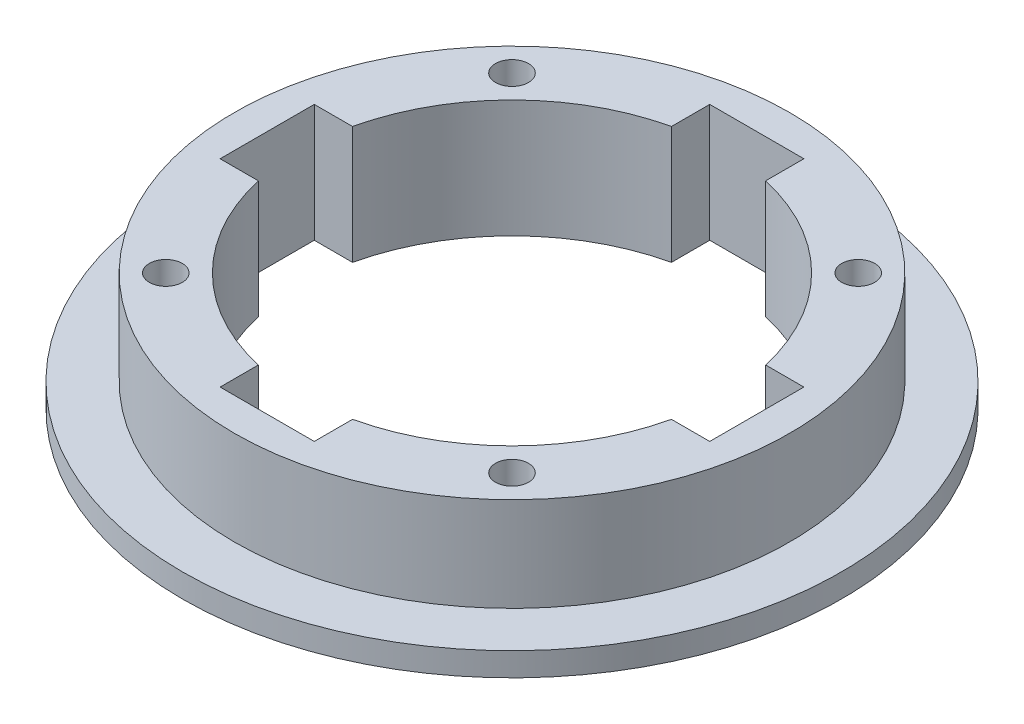
ISO-10303-21;
HEADER;
FILE_DESCRIPTION(('STEP AP214'),'2;1');
FILE_NAME('part.step','',(''),(''),'','','');
FILE_SCHEMA(('AUTOMOTIVE_DESIGN { 1 0 10303 214 1 1 1 1 }'));
ENDSEC;
DATA;
#1=APPLICATION_CONTEXT('core data for automotive mechanical design processes');
#2=APPLICATION_PROTOCOL_DEFINITION('international standard','automotive_design',2000,#1);
#3=PRODUCT_CONTEXT('',#1,'mechanical');
#4=PRODUCT('Part','Part','',(#3));
#5=PRODUCT_RELATED_PRODUCT_CATEGORY('part','',(#4));
#6=PRODUCT_DEFINITION_FORMATION('','',#4);
#7=PRODUCT_DEFINITION_CONTEXT('part definition',#1,'design');
#8=PRODUCT_DEFINITION('design','',#6,#7);
#9=PRODUCT_DEFINITION_SHAPE('','',#8);
#10=(LENGTH_UNIT() NAMED_UNIT(*) SI_UNIT(.MILLI.,.METRE.));
#11=(NAMED_UNIT(*) PLANE_ANGLE_UNIT() SI_UNIT($,.RADIAN.));
#12=(NAMED_UNIT(*) SI_UNIT($,.STERADIAN.) SOLID_ANGLE_UNIT());
#13=UNCERTAINTY_MEASURE_WITH_UNIT(LENGTH_MEASURE(1.E-05),#10,'distance_accuracy_value','');
#14=(GEOMETRIC_REPRESENTATION_CONTEXT(3) GLOBAL_UNCERTAINTY_ASSIGNED_CONTEXT((#13)) GLOBAL_UNIT_ASSIGNED_CONTEXT((#10,
#11,#12)) REPRESENTATION_CONTEXT('',''));
#15=CARTESIAN_POINT('',(0.,0.,0.));
#16=DIRECTION('',(0.,0.,1.));
#17=DIRECTION('',(1.,0.,0.));
#18=AXIS2_PLACEMENT_3D('',#15,#16,#17);
#19=CARTESIAN_POINT('',(0.,2.5,0.));
#20=DIRECTION('',(0.,-1.,0.));
#21=DIRECTION('',(0.,0.,-1.));
#22=AXIS2_PLACEMENT_3D('',#19,#20,#21);
#23=CYLINDRICAL_SURFACE('',#22,22.5);
#24=DIRECTION('',(0.,1.,0.));
#25=VECTOR('',#24,1.);
#26=CARTESIAN_POINT('',(-5.,0.,-21.9374109684803));
#27=LINE('',#26,#25);
#28=CARTESIAN_POINT('',(-5.,0.,-21.9374109684803));
#29=VERTEX_POINT('',#28);
#30=CARTESIAN_POINT('',(-5.,12.5,-21.9374109684803));
#31=VERTEX_POINT('',#30);
#32=EDGE_CURVE('E217',#29,#31,#27,.T.);
#33=ORIENTED_EDGE('',*,*,#32,.T.);
#34=CARTESIAN_POINT('',(0.,12.5,0.));
#35=DIRECTION('',(0.,1.,0.));
#36=DIRECTION('',(0.,0.,1.));
#37=AXIS2_PLACEMENT_3D('',#34,#35,#36);
#38=CIRCLE('',#37,22.5);
#39=CARTESIAN_POINT('',(-21.9374109684803,12.5,-5.));
#40=VERTEX_POINT('',#39);
#41=EDGE_CURVE('E162',#31,#40,#38,.T.);
#42=ORIENTED_EDGE('',*,*,#41,.T.);
#43=DIRECTION('',(0.,1.,0.));
#44=VECTOR('',#43,1.);
#45=CARTESIAN_POINT('',(-21.9374109684803,0.,-5.));
#46=LINE('',#45,#44);
#47=CARTESIAN_POINT('',(-21.9374109684803,0.,-5.));
#48=VERTEX_POINT('',#47);
#49=EDGE_CURVE('E56',#48,#40,#46,.T.);
#50=ORIENTED_EDGE('',*,*,#49,.F.);
#51=CARTESIAN_POINT('',(0.,0.,0.));
#52=DIRECTION('',(0.,1.,0.));
#53=DIRECTION('',(0.,0.,1.));
#54=AXIS2_PLACEMENT_3D('',#51,#52,#53);
#55=CIRCLE('',#54,22.5);
#56=EDGE_CURVE('E160',#29,#48,#55,.T.);
#57=ORIENTED_EDGE('',*,*,#56,.F.);
#58=EDGE_LOOP('',(#33,#42,#50,#57));
#59=FACE_BOUND('',#58,.T.);
#60=ADVANCED_FACE('F33',(#59),#23,.F.);
#61=DIRECTION('',(0.,1.,0.));
#62=VECTOR('',#61,1.);
#63=CARTESIAN_POINT('',(5.,0.,-21.9374109684803));
#64=LINE('',#63,#62);
#65=CARTESIAN_POINT('',(5.,0.,-21.9374109684803));
#66=VERTEX_POINT('',#65);
#67=CARTESIAN_POINT('',(5.,12.5,-21.9374109684803));
#68=VERTEX_POINT('',#67);
#69=EDGE_CURVE('E211',#66,#68,#64,.T.);
#70=ORIENTED_EDGE('',*,*,#69,.F.);
#71=CARTESIAN_POINT('',(21.9374109684803,0.,-5.));
#72=VERTEX_POINT('',#71);
#73=EDGE_CURVE('E169',#72,#66,#55,.T.);
#74=ORIENTED_EDGE('',*,*,#73,.F.);
#75=DIRECTION('',(0.,1.,0.));
#76=VECTOR('',#75,1.);
#77=CARTESIAN_POINT('',(21.9374109684803,0.,-5.));
#78=LINE('',#77,#76);
#79=CARTESIAN_POINT('',(21.9374109684803,12.5,-5.));
#80=VERTEX_POINT('',#79);
#81=EDGE_CURVE('E208',#72,#80,#78,.T.);
#82=ORIENTED_EDGE('',*,*,#81,.T.);
#83=EDGE_CURVE('E185',#80,#68,#38,.T.);
#84=ORIENTED_EDGE('',*,*,#83,.T.);
#85=EDGE_LOOP('',(#70,#74,#82,#84));
#86=FACE_BOUND('',#85,.T.);
#87=ADVANCED_FACE('F341',(#86),#23,.F.);
#88=DIRECTION('',(0.,1.,0.));
#89=VECTOR('',#88,1.);
#90=CARTESIAN_POINT('',(21.9374109684803,0.,4.99999999999999));
#91=LINE('',#90,#89);
#92=CARTESIAN_POINT('',(21.9374109684803,0.,4.99999999999999));
#93=VERTEX_POINT('',#92);
#94=CARTESIAN_POINT('',(21.9374109684803,12.5,5.));
#95=VERTEX_POINT('',#94);
#96=EDGE_CURVE('E202',#93,#95,#91,.T.);
#97=ORIENTED_EDGE('',*,*,#96,.F.);
#98=CARTESIAN_POINT('',(5.,0.,21.9374109684803));
#99=VERTEX_POINT('',#98);
#100=EDGE_CURVE('E173',#99,#93,#55,.T.);
#101=ORIENTED_EDGE('',*,*,#100,.F.);
#102=DIRECTION('',(0.,1.,0.));
#103=VECTOR('',#102,1.);
#104=CARTESIAN_POINT('',(5.,0.,21.9374109684803));
#105=LINE('',#104,#103);
#106=CARTESIAN_POINT('',(5.,12.5,21.9374109684803));
#107=VERTEX_POINT('',#106);
#108=EDGE_CURVE('E199',#99,#107,#105,.T.);
#109=ORIENTED_EDGE('',*,*,#108,.T.);
#110=EDGE_CURVE('E181',#107,#95,#38,.T.);
#111=ORIENTED_EDGE('',*,*,#110,.T.);
#112=EDGE_LOOP('',(#97,#101,#109,#111));
#113=FACE_BOUND('',#112,.T.);
#114=ADVANCED_FACE('F334',(#113),#23,.F.);
#115=CARTESIAN_POINT('',(0.,2.5,0.));
#116=DIRECTION('',(0.,1.,0.));
#117=DIRECTION('',(0.,0.,1.));
#118=AXIS2_PLACEMENT_3D('',#115,#116,#117);
#119=PLANE('',#118);
#120=CARTESIAN_POINT('',(0.,2.5,0.));
#121=DIRECTION('',(0.,1.,0.));
#122=DIRECTION('',(0.,0.,1.));
#123=AXIS2_PLACEMENT_3D('',#120,#121,#122);
#124=CIRCLE('',#123,35.);
#125=CARTESIAN_POINT('',(0.,2.5,35.));
#126=VERTEX_POINT('',#125);
#127=EDGE_CURVE('E11',#126,#126,#124,.T.);
#128=ORIENTED_EDGE('',*,*,#127,.T.);
#129=EDGE_LOOP('',(#128));
#130=FACE_BOUND('',#129,.T.);
#131=CARTESIAN_POINT('',(0.,2.5,0.));
#132=DIRECTION('',(0.,1.,0.));
#133=DIRECTION('',(0.,0.,1.));
#134=AXIS2_PLACEMENT_3D('',#131,#132,#133);
#135=CIRCLE('',#134,29.5);
#136=CARTESIAN_POINT('',(0.,2.5,29.5));
#137=VERTEX_POINT('',#136);
#138=EDGE_CURVE('E178',#137,#137,#135,.T.);
#139=ORIENTED_EDGE('',*,*,#138,.F.);
#140=EDGE_LOOP('',(#139));
#141=FACE_BOUND('',#140,.T.);
#142=ADVANCED_FACE('F332',(#130,#141),#119,.T.);
#143=CARTESIAN_POINT('',(0.,0.,0.));
#144=DIRECTION('',(0.,1.,0.));
#145=DIRECTION('',(0.,0.,1.));
#146=AXIS2_PLACEMENT_3D('',#143,#144,#145);
#147=PLANE('',#146);
#148=CARTESIAN_POINT('',(-18.3847763108502,0.,-18.3847763108503));
#149=DIRECTION('',(0.,1.,0.));
#150=DIRECTION('',(0.,0.,1.));
#151=AXIS2_PLACEMENT_3D('',#148,#149,#150);
#152=CIRCLE('',#151,1.75);
#153=CARTESIAN_POINT('',(-18.3847763108502,0.,-16.6347763108503));
#154=VERTEX_POINT('',#153);
#155=EDGE_CURVE('E280',#154,#154,#152,.T.);
#156=ORIENTED_EDGE('',*,*,#155,.T.);
#157=EDGE_LOOP('',(#156));
#158=FACE_BOUND('',#157,.T.);
#159=CARTESIAN_POINT('',(18.3847763108503,0.,-18.3847763108501));
#160=DIRECTION('',(0.,1.,0.));
#161=DIRECTION('',(0.,0.,1.));
#162=AXIS2_PLACEMENT_3D('',#159,#160,#161);
#163=CIRCLE('',#162,1.75);
#164=CARTESIAN_POINT('',(18.3847763108503,0.,-16.6347763108501));
#165=VERTEX_POINT('',#164);
#166=EDGE_CURVE('E292',#165,#165,#163,.T.);
#167=ORIENTED_EDGE('',*,*,#166,.T.);
#168=EDGE_LOOP('',(#167));
#169=FACE_BOUND('',#168,.T.);
#170=CARTESIAN_POINT('',(18.3847763108501,0.,18.3847763108504));
#171=DIRECTION('',(0.,1.,0.));
#172=DIRECTION('',(0.,0.,1.));
#173=AXIS2_PLACEMENT_3D('',#170,#171,#172);
#174=CIRCLE('',#173,1.75);
#175=CARTESIAN_POINT('',(18.3847763108501,0.,20.1347763108504));
#176=VERTEX_POINT('',#175);
#177=EDGE_CURVE('E286',#176,#176,#174,.T.);
#178=ORIENTED_EDGE('',*,*,#177,.T.);
#179=EDGE_LOOP('',(#178));
#180=FACE_BOUND('',#179,.T.);
#181=CARTESIAN_POINT('',(-18.3847763108502,0.,18.3847763108503));
#182=DIRECTION('',(0.,1.,0.));
#183=DIRECTION('',(0.,0.,1.));
#184=AXIS2_PLACEMENT_3D('',#181,#182,#183);
#185=CIRCLE('',#184,1.75);
#186=CARTESIAN_POINT('',(-18.3847763108502,0.,20.1347763108503));
#187=VERTEX_POINT('',#186);
#188=EDGE_CURVE('E248',#187,#187,#185,.T.);
#189=ORIENTED_EDGE('',*,*,#188,.T.);
#190=EDGE_LOOP('',(#189));
#191=FACE_BOUND('',#190,.T.);
#192=CARTESIAN_POINT('',(0.,0.,0.));
#193=DIRECTION('',(0.,1.,0.));
#194=DIRECTION('',(0.,0.,1.));
#195=AXIS2_PLACEMENT_3D('',#192,#193,#194);
#196=CIRCLE('',#195,35.);
#197=CARTESIAN_POINT('',(0.,0.,35.));
#198=VERTEX_POINT('',#197);
#199=EDGE_CURVE('E37',#198,#198,#196,.T.);
#200=ORIENTED_EDGE('',*,*,#199,.F.);
#201=EDGE_LOOP('',(#200));
#202=FACE_BOUND('',#201,.T.);
#203=DIRECTION('',(-1.,0.,0.));
#204=VECTOR('',#203,1.);
#205=CARTESIAN_POINT('',(5.,0.,-26.));
#206=LINE('',#205,#204);
#207=CARTESIAN_POINT('',(5.,0.,-26.));
#208=VERTEX_POINT('',#207);
#209=CARTESIAN_POINT('',(-5.,0.,-26.));
#210=VERTEX_POINT('',#209);
#211=EDGE_CURVE('E250',#208,#210,#206,.T.);
#212=ORIENTED_EDGE('',*,*,#211,.T.);
#213=DIRECTION('',(0.,0.,1.));
#214=VECTOR('',#213,1.);
#215=CARTESIAN_POINT('',(-5.,0.,-21.9374109684803));
#216=LINE('',#215,#214);
#217=EDGE_CURVE('E163',#210,#29,#216,.T.);
#218=ORIENTED_EDGE('',*,*,#217,.T.);
#219=ORIENTED_EDGE('',*,*,#56,.T.);
#220=DIRECTION('',(-1.,0.,0.));
#221=VECTOR('',#220,1.);
#222=CARTESIAN_POINT('',(-21.9374109684803,0.,-5.));
#223=LINE('',#222,#221);
#224=CARTESIAN_POINT('',(-26.,0.,-5.));
#225=VERTEX_POINT('',#224);
#226=EDGE_CURVE('E146',#48,#225,#223,.T.);
#227=ORIENTED_EDGE('',*,*,#226,.T.);
#228=DIRECTION('',(0.,0.,1.));
#229=VECTOR('',#228,1.);
#230=CARTESIAN_POINT('',(-26.,0.,5.));
#231=LINE('',#230,#229);
#232=CARTESIAN_POINT('',(-26.,0.,5.));
#233=VERTEX_POINT('',#232);
#234=EDGE_CURVE('E153',#225,#233,#231,.T.);
#235=ORIENTED_EDGE('',*,*,#234,.T.);
#236=DIRECTION('',(1.,0.,0.));
#237=VECTOR('',#236,1.);
#238=CARTESIAN_POINT('',(-21.9374109684803,0.,5.));
#239=LINE('',#238,#237);
#240=CARTESIAN_POINT('',(-21.9374109684803,0.,5.));
#241=VERTEX_POINT('',#240);
#242=EDGE_CURVE('E273',#233,#241,#239,.T.);
#243=ORIENTED_EDGE('',*,*,#242,.T.);
#244=CARTESIAN_POINT('',(-5.,0.,21.9374109684803));
#245=VERTEX_POINT('',#244);
#246=EDGE_CURVE('E170',#241,#245,#55,.T.);
#247=ORIENTED_EDGE('',*,*,#246,.T.);
#248=DIRECTION('',(0.,0.,1.));
#249=VECTOR('',#248,1.);
#250=CARTESIAN_POINT('',(-5.,0.,26.));
#251=LINE('',#250,#249);
#252=CARTESIAN_POINT('',(-5.,0.,26.));
#253=VERTEX_POINT('',#252);
#254=EDGE_CURVE('E270',#245,#253,#251,.T.);
#255=ORIENTED_EDGE('',*,*,#254,.T.);
#256=DIRECTION('',(1.,0.,0.));
#257=VECTOR('',#256,1.);
#258=CARTESIAN_POINT('',(5.,0.,26.));
#259=LINE('',#258,#257);
#260=CARTESIAN_POINT('',(5.,0.,26.));
#261=VERTEX_POINT('',#260);
#262=EDGE_CURVE('E267',#253,#261,#259,.T.);
#263=ORIENTED_EDGE('',*,*,#262,.T.);
#264=DIRECTION('',(0.,0.,-1.));
#265=VECTOR('',#264,1.);
#266=CARTESIAN_POINT('',(5.,0.,26.));
#267=LINE('',#266,#265);
#268=EDGE_CURVE('E264',#261,#99,#267,.T.);
#269=ORIENTED_EDGE('',*,*,#268,.T.);
#270=ORIENTED_EDGE('',*,*,#100,.T.);
#271=DIRECTION('',(1.,0.,0.));
#272=VECTOR('',#271,1.);
#273=CARTESIAN_POINT('',(26.,0.,5.));
#274=LINE('',#273,#272);
#275=CARTESIAN_POINT('',(26.,0.,5.));
#276=VERTEX_POINT('',#275);
#277=EDGE_CURVE('E261',#93,#276,#274,.T.);
#278=ORIENTED_EDGE('',*,*,#277,.T.);
#279=DIRECTION('',(0.,0.,-1.));
#280=VECTOR('',#279,1.);
#281=CARTESIAN_POINT('',(26.,0.,5.));
#282=LINE('',#281,#280);
#283=CARTESIAN_POINT('',(26.,0.,-5.));
#284=VERTEX_POINT('',#283);
#285=EDGE_CURVE('E258',#276,#284,#282,.T.);
#286=ORIENTED_EDGE('',*,*,#285,.T.);
#287=DIRECTION('',(-1.,0.,0.));
#288=VECTOR('',#287,1.);
#289=CARTESIAN_POINT('',(26.,0.,-5.));
#290=LINE('',#289,#288);
#291=EDGE_CURVE('E255',#284,#72,#290,.T.);
#292=ORIENTED_EDGE('',*,*,#291,.T.);
#293=ORIENTED_EDGE('',*,*,#73,.T.);
#294=DIRECTION('',(0.,0.,-1.));
#295=VECTOR('',#294,1.);
#296=CARTESIAN_POINT('',(5.,0.,-21.9374109684803));
#297=LINE('',#296,#295);
#298=EDGE_CURVE('E252',#66,#208,#297,.T.);
#299=ORIENTED_EDGE('',*,*,#298,.T.);
#300=EDGE_LOOP('',(#212,#218,#219,#227,#235,#243,#247,#255,#263,#269,#270,#278,#286,#292,#293,#299));
#301=FACE_BOUND('',#300,.T.);
#302=ADVANCED_FACE('F167',(#158,#169,#180,#191,#202,#301),#147,.F.);
#303=CARTESIAN_POINT('',(0.,2.5,0.));
#304=DIRECTION('',(0.,-1.,0.));
#305=DIRECTION('',(0.,0.,-1.));
#306=AXIS2_PLACEMENT_3D('',#303,#304,#305);
#307=CYLINDRICAL_SURFACE('',#306,35.);
#308=ORIENTED_EDGE('',*,*,#127,.F.);
#309=EDGE_LOOP('',(#308));
#310=FACE_BOUND('',#309,.T.);
#311=ORIENTED_EDGE('',*,*,#199,.T.);
#312=EDGE_LOOP('',(#311));
#313=FACE_BOUND('',#312,.T.);
#314=ADVANCED_FACE('F35',(#310,#313),#307,.T.);
#315=DIRECTION('',(0.,1.,0.));
#316=VECTOR('',#315,1.);
#317=CARTESIAN_POINT('',(-5.,0.,21.9374109684803));
#318=LINE('',#317,#316);
#319=CARTESIAN_POINT('',(-5.,12.5,21.9374109684803));
#320=VERTEX_POINT('',#319);
#321=EDGE_CURVE('E48',#245,#320,#318,.T.);
#322=ORIENTED_EDGE('',*,*,#321,.F.);
#323=ORIENTED_EDGE('',*,*,#246,.F.);
#324=DIRECTION('',(0.,1.,0.));
#325=VECTOR('',#324,1.);
#326=CARTESIAN_POINT('',(-21.9374109684803,0.,5.));
#327=LINE('',#326,#325);
#328=CARTESIAN_POINT('',(-21.9374109684803,12.5,5.));
#329=VERTEX_POINT('',#328);
#330=EDGE_CURVE('E191',#241,#329,#327,.T.);
#331=ORIENTED_EDGE('',*,*,#330,.T.);
#332=EDGE_CURVE('E186',#329,#320,#38,.T.);
#333=ORIENTED_EDGE('',*,*,#332,.T.);
#334=EDGE_LOOP('',(#322,#323,#331,#333));
#335=FACE_BOUND('',#334,.T.);
#336=ADVANCED_FACE('F314',(#335),#23,.F.);
#337=CARTESIAN_POINT('',(0.,12.5,0.));
#338=DIRECTION('',(0.,1.,0.));
#339=DIRECTION('',(0.,0.,1.));
#340=AXIS2_PLACEMENT_3D('',#337,#338,#339);
#341=PLANE('',#340);
#342=CARTESIAN_POINT('',(-18.3847763108502,12.5,-18.3847763108503));
#343=DIRECTION('',(0.,1.,0.));
#344=DIRECTION('',(0.,0.,1.));
#345=AXIS2_PLACEMENT_3D('',#342,#343,#344);
#346=CIRCLE('',#345,1.75);
#347=CARTESIAN_POINT('',(-18.3847763108502,12.5,-16.6347763108503));
#348=VERTEX_POINT('',#347);
#349=EDGE_CURVE('E295',#348,#348,#346,.T.);
#350=ORIENTED_EDGE('',*,*,#349,.F.);
#351=EDGE_LOOP('',(#350));
#352=FACE_BOUND('',#351,.T.);
#353=CARTESIAN_POINT('',(18.3847763108503,12.5,-18.3847763108501));
#354=DIRECTION('',(0.,1.,0.));
#355=DIRECTION('',(0.,0.,1.));
#356=AXIS2_PLACEMENT_3D('',#353,#354,#355);
#357=CIRCLE('',#356,1.75);
#358=CARTESIAN_POINT('',(18.3847763108503,12.5,-16.6347763108501));
#359=VERTEX_POINT('',#358);
#360=EDGE_CURVE('E289',#359,#359,#357,.T.);
#361=ORIENTED_EDGE('',*,*,#360,.F.);
#362=EDGE_LOOP('',(#361));
#363=FACE_BOUND('',#362,.T.);
#364=CARTESIAN_POINT('',(18.3847763108501,12.5,18.3847763108504));
#365=DIRECTION('',(0.,1.,0.));
#366=DIRECTION('',(0.,0.,1.));
#367=AXIS2_PLACEMENT_3D('',#364,#365,#366);
#368=CIRCLE('',#367,1.75);
#369=CARTESIAN_POINT('',(18.3847763108501,12.5,20.1347763108504));
#370=VERTEX_POINT('',#369);
#371=EDGE_CURVE('E283',#370,#370,#368,.T.);
#372=ORIENTED_EDGE('',*,*,#371,.F.);
#373=EDGE_LOOP('',(#372));
#374=FACE_BOUND('',#373,.T.);
#375=CARTESIAN_POINT('',(-18.3847763108502,12.5,18.3847763108503));
#376=DIRECTION('',(0.,1.,0.));
#377=DIRECTION('',(0.,0.,1.));
#378=AXIS2_PLACEMENT_3D('',#375,#376,#377);
#379=CIRCLE('',#378,1.75);
#380=CARTESIAN_POINT('',(-18.3847763108502,12.5,20.1347763108503));
#381=VERTEX_POINT('',#380);
#382=EDGE_CURVE('E277',#381,#381,#379,.T.);
#383=ORIENTED_EDGE('',*,*,#382,.F.);
#384=EDGE_LOOP('',(#383));
#385=FACE_BOUND('',#384,.T.);
#386=DIRECTION('',(0.,0.,1.));
#387=VECTOR('',#386,1.);
#388=CARTESIAN_POINT('',(-5.,12.5,-21.9374109684803));
#389=LINE('',#388,#387);
#390=CARTESIAN_POINT('',(-5.,12.5,-26.));
#391=VERTEX_POINT('',#390);
#392=EDGE_CURVE('E154',#391,#31,#389,.T.);
#393=ORIENTED_EDGE('',*,*,#392,.F.);
#394=DIRECTION('',(-1.,0.,0.));
#395=VECTOR('',#394,1.);
#396=CARTESIAN_POINT('',(5.,12.5,-26.));
#397=LINE('',#396,#395);
#398=CARTESIAN_POINT('',(5.,12.5,-26.));
#399=VERTEX_POINT('',#398);
#400=EDGE_CURVE('E220',#399,#391,#397,.T.);
#401=ORIENTED_EDGE('',*,*,#400,.F.);
#402=DIRECTION('',(0.,0.,-1.));
#403=VECTOR('',#402,1.);
#404=CARTESIAN_POINT('',(5.,12.5,-21.9374109684803));
#405=LINE('',#404,#403);
#406=EDGE_CURVE('E223',#68,#399,#405,.T.);
#407=ORIENTED_EDGE('',*,*,#406,.F.);
#408=ORIENTED_EDGE('',*,*,#83,.F.);
#409=DIRECTION('',(-1.,0.,0.));
#410=VECTOR('',#409,1.);
#411=CARTESIAN_POINT('',(26.,12.5,-5.));
#412=LINE('',#411,#410);
#413=CARTESIAN_POINT('',(26.,12.5,-5.));
#414=VERTEX_POINT('',#413);
#415=EDGE_CURVE('E226',#414,#80,#412,.T.);
#416=ORIENTED_EDGE('',*,*,#415,.F.);
#417=DIRECTION('',(0.,0.,-1.));
#418=VECTOR('',#417,1.);
#419=CARTESIAN_POINT('',(26.,12.5,5.));
#420=LINE('',#419,#418);
#421=CARTESIAN_POINT('',(26.,12.5,5.));
#422=VERTEX_POINT('',#421);
#423=EDGE_CURVE('E228',#422,#414,#420,.T.);
#424=ORIENTED_EDGE('',*,*,#423,.F.);
#425=DIRECTION('',(1.,0.,0.));
#426=VECTOR('',#425,1.);
#427=CARTESIAN_POINT('',(26.,12.5,5.));
#428=LINE('',#427,#426);
#429=EDGE_CURVE('E231',#95,#422,#428,.T.);
#430=ORIENTED_EDGE('',*,*,#429,.F.);
#431=ORIENTED_EDGE('',*,*,#110,.F.);
#432=DIRECTION('',(0.,0.,-1.));
#433=VECTOR('',#432,1.);
#434=CARTESIAN_POINT('',(5.,12.5,26.));
#435=LINE('',#434,#433);
#436=CARTESIAN_POINT('',(5.,12.5,26.));
#437=VERTEX_POINT('',#436);
#438=EDGE_CURVE('E234',#437,#107,#435,.T.);
#439=ORIENTED_EDGE('',*,*,#438,.F.);
#440=DIRECTION('',(1.,0.,0.));
#441=VECTOR('',#440,1.);
#442=CARTESIAN_POINT('',(5.,12.5,26.));
#443=LINE('',#442,#441);
#444=CARTESIAN_POINT('',(-5.,12.5,26.));
#445=VERTEX_POINT('',#444);
#446=EDGE_CURVE('E236',#445,#437,#443,.T.);
#447=ORIENTED_EDGE('',*,*,#446,.F.);
#448=DIRECTION('',(0.,0.,1.));
#449=VECTOR('',#448,1.);
#450=CARTESIAN_POINT('',(-5.,12.5,26.));
#451=LINE('',#450,#449);
#452=EDGE_CURVE('E239',#320,#445,#451,.T.);
#453=ORIENTED_EDGE('',*,*,#452,.F.);
#454=ORIENTED_EDGE('',*,*,#332,.F.);
#455=DIRECTION('',(1.,0.,0.));
#456=VECTOR('',#455,1.);
#457=CARTESIAN_POINT('',(-21.9374109684803,12.5,5.));
#458=LINE('',#457,#456);
#459=CARTESIAN_POINT('',(-26.,12.5,5.));
#460=VERTEX_POINT('',#459);
#461=EDGE_CURVE('E241',#460,#329,#458,.T.);
#462=ORIENTED_EDGE('',*,*,#461,.F.);
#463=DIRECTION('',(0.,0.,1.));
#464=VECTOR('',#463,1.);
#465=CARTESIAN_POINT('',(-26.,12.5,5.));
#466=LINE('',#465,#464);
#467=CARTESIAN_POINT('',(-26.,12.5,-5.));
#468=VERTEX_POINT('',#467);
#469=EDGE_CURVE('E243',#468,#460,#466,.T.);
#470=ORIENTED_EDGE('',*,*,#469,.F.);
#471=DIRECTION('',(-1.,0.,0.));
#472=VECTOR('',#471,1.);
#473=CARTESIAN_POINT('',(-21.9374109684803,12.5,-5.));
#474=LINE('',#473,#472);
#475=EDGE_CURVE('E246',#40,#468,#474,.T.);
#476=ORIENTED_EDGE('',*,*,#475,.F.);
#477=ORIENTED_EDGE('',*,*,#41,.F.);
#478=EDGE_LOOP('',(#393,#401,#407,#408,#416,#424,#430,#431,#439,#447,#453,#454,#462,#470,#476,#477));
#479=FACE_BOUND('',#478,.T.);
#480=CARTESIAN_POINT('',(0.,12.5,0.));
#481=DIRECTION('',(0.,1.,0.));
#482=DIRECTION('',(0.,0.,1.));
#483=AXIS2_PLACEMENT_3D('',#480,#481,#482);
#484=CIRCLE('',#483,29.5);
#485=CARTESIAN_POINT('',(0.,12.5,29.5));
#486=VERTEX_POINT('',#485);
#487=EDGE_CURVE('E175',#486,#486,#484,.T.);
#488=ORIENTED_EDGE('',*,*,#487,.T.);
#489=EDGE_LOOP('',(#488));
#490=FACE_BOUND('',#489,.T.);
#491=ADVANCED_FACE('F310',(#352,#363,#374,#385,#479,#490),#341,.T.);
#492=CARTESIAN_POINT('',(0.,12.5,0.));
#493=DIRECTION('',(0.,-1.,0.));
#494=DIRECTION('',(0.,0.,-1.));
#495=AXIS2_PLACEMENT_3D('',#492,#493,#494);
#496=CYLINDRICAL_SURFACE('',#495,29.5);
#497=ORIENTED_EDGE('',*,*,#487,.F.);
#498=EDGE_LOOP('',(#497));
#499=FACE_BOUND('',#498,.T.);
#500=ORIENTED_EDGE('',*,*,#138,.T.);
#501=EDGE_LOOP('',(#500));
#502=FACE_BOUND('',#501,.T.);
#503=ADVANCED_FACE('F313',(#499,#502),#496,.T.);
#504=CARTESIAN_POINT('',(-21.9374109684803,0.,-5.));
#505=DIRECTION('',(0.,0.,-1.));
#506=DIRECTION('',(-1.,0.,0.));
#507=AXIS2_PLACEMENT_3D('',#504,#505,#506);
#508=PLANE('',#507);
#509=ORIENTED_EDGE('',*,*,#475,.T.);
#510=DIRECTION('',(0.,1.,0.));
#511=VECTOR('',#510,1.);
#512=CARTESIAN_POINT('',(-26.,0.,-5.));
#513=LINE('',#512,#511);
#514=EDGE_CURVE('E148',#225,#468,#513,.T.);
#515=ORIENTED_EDGE('',*,*,#514,.F.);
#516=ORIENTED_EDGE('',*,*,#226,.F.);
#517=ORIENTED_EDGE('',*,*,#49,.T.);
#518=EDGE_LOOP('',(#509,#515,#516,#517));
#519=FACE_BOUND('',#518,.T.);
#520=ADVANCED_FACE('F147',(#519),#508,.F.);
#521=CARTESIAN_POINT('',(-26.,0.,5.));
#522=DIRECTION('',(-1.,0.,0.));
#523=DIRECTION('',(0.,0.,1.));
#524=AXIS2_PLACEMENT_3D('',#521,#522,#523);
#525=PLANE('',#524);
#526=ORIENTED_EDGE('',*,*,#469,.T.);
#527=DIRECTION('',(0.,1.,0.));
#528=VECTOR('',#527,1.);
#529=CARTESIAN_POINT('',(-26.,0.,5.));
#530=LINE('',#529,#528);
#531=EDGE_CURVE('E189',#233,#460,#530,.T.);
#532=ORIENTED_EDGE('',*,*,#531,.F.);
#533=ORIENTED_EDGE('',*,*,#234,.F.);
#534=ORIENTED_EDGE('',*,*,#514,.T.);
#535=EDGE_LOOP('',(#526,#532,#533,#534));
#536=FACE_BOUND('',#535,.T.);
#537=ADVANCED_FACE('F400',(#536),#525,.F.);
#538=CARTESIAN_POINT('',(-21.9374109684803,0.,5.));
#539=DIRECTION('',(0.,0.,1.));
#540=DIRECTION('',(1.,0.,0.));
#541=AXIS2_PLACEMENT_3D('',#538,#539,#540);
#542=PLANE('',#541);
#543=ORIENTED_EDGE('',*,*,#461,.T.);
#544=ORIENTED_EDGE('',*,*,#330,.F.);
#545=ORIENTED_EDGE('',*,*,#242,.F.);
#546=ORIENTED_EDGE('',*,*,#531,.T.);
#547=EDGE_LOOP('',(#543,#544,#545,#546));
#548=FACE_BOUND('',#547,.T.);
#549=ADVANCED_FACE('F360',(#548),#542,.F.);
#550=CARTESIAN_POINT('',(-5.,0.,26.));
#551=DIRECTION('',(-1.,0.,0.));
#552=DIRECTION('',(0.,0.,1.));
#553=AXIS2_PLACEMENT_3D('',#550,#551,#552);
#554=PLANE('',#553);
#555=ORIENTED_EDGE('',*,*,#452,.T.);
#556=DIRECTION('',(0.,1.,0.));
#557=VECTOR('',#556,1.);
#558=CARTESIAN_POINT('',(-5.,0.,26.));
#559=LINE('',#558,#557);
#560=EDGE_CURVE('E195',#253,#445,#559,.T.);
#561=ORIENTED_EDGE('',*,*,#560,.F.);
#562=ORIENTED_EDGE('',*,*,#254,.F.);
#563=ORIENTED_EDGE('',*,*,#321,.T.);
#564=EDGE_LOOP('',(#555,#561,#562,#563));
#565=FACE_BOUND('',#564,.T.);
#566=ADVANCED_FACE('F392',(#565),#554,.F.);
#567=CARTESIAN_POINT('',(5.,0.,26.));
#568=DIRECTION('',(0.,0.,1.));
#569=DIRECTION('',(1.,0.,0.));
#570=AXIS2_PLACEMENT_3D('',#567,#568,#569);
#571=PLANE('',#570);
#572=ORIENTED_EDGE('',*,*,#446,.T.);
#573=DIRECTION('',(0.,1.,0.));
#574=VECTOR('',#573,1.);
#575=CARTESIAN_POINT('',(5.,0.,26.));
#576=LINE('',#575,#574);
#577=EDGE_CURVE('E197',#261,#437,#576,.T.);
#578=ORIENTED_EDGE('',*,*,#577,.F.);
#579=ORIENTED_EDGE('',*,*,#262,.F.);
#580=ORIENTED_EDGE('',*,*,#560,.T.);
#581=EDGE_LOOP('',(#572,#578,#579,#580));
#582=FACE_BOUND('',#581,.T.);
#583=ADVANCED_FACE('F391',(#582),#571,.F.);
#584=CARTESIAN_POINT('',(5.,0.,26.));
#585=DIRECTION('',(1.,0.,0.));
#586=DIRECTION('',(0.,0.,-1.));
#587=AXIS2_PLACEMENT_3D('',#584,#585,#586);
#588=PLANE('',#587);
#589=ORIENTED_EDGE('',*,*,#438,.T.);
#590=ORIENTED_EDGE('',*,*,#108,.F.);
#591=ORIENTED_EDGE('',*,*,#268,.F.);
#592=ORIENTED_EDGE('',*,*,#577,.T.);
#593=EDGE_LOOP('',(#589,#590,#591,#592));
#594=FACE_BOUND('',#593,.T.);
#595=ADVANCED_FACE('F388',(#594),#588,.F.);
#596=CARTESIAN_POINT('',(26.,0.,5.));
#597=DIRECTION('',(0.,0.,1.));
#598=DIRECTION('',(1.,0.,0.));
#599=AXIS2_PLACEMENT_3D('',#596,#597,#598);
#600=PLANE('',#599);
#601=ORIENTED_EDGE('',*,*,#429,.T.);
#602=DIRECTION('',(0.,1.,0.));
#603=VECTOR('',#602,1.);
#604=CARTESIAN_POINT('',(26.,0.,5.));
#605=LINE('',#604,#603);
#606=EDGE_CURVE('E204',#276,#422,#605,.T.);
#607=ORIENTED_EDGE('',*,*,#606,.F.);
#608=ORIENTED_EDGE('',*,*,#277,.F.);
#609=ORIENTED_EDGE('',*,*,#96,.T.);
#610=EDGE_LOOP('',(#601,#607,#608,#609));
#611=FACE_BOUND('',#610,.T.);
#612=ADVANCED_FACE('F439',(#611),#600,.F.);
#613=CARTESIAN_POINT('',(26.,0.,5.));
#614=DIRECTION('',(1.,0.,0.));
#615=DIRECTION('',(0.,0.,-1.));
#616=AXIS2_PLACEMENT_3D('',#613,#614,#615);
#617=PLANE('',#616);
#618=ORIENTED_EDGE('',*,*,#423,.T.);
#619=DIRECTION('',(0.,1.,0.));
#620=VECTOR('',#619,1.);
#621=CARTESIAN_POINT('',(26.,0.,-5.));
#622=LINE('',#621,#620);
#623=EDGE_CURVE('E206',#284,#414,#622,.T.);
#624=ORIENTED_EDGE('',*,*,#623,.F.);
#625=ORIENTED_EDGE('',*,*,#285,.F.);
#626=ORIENTED_EDGE('',*,*,#606,.T.);
#627=EDGE_LOOP('',(#618,#624,#625,#626));
#628=FACE_BOUND('',#627,.T.);
#629=ADVANCED_FACE('F379',(#628),#617,.F.);
#630=CARTESIAN_POINT('',(26.,0.,-5.));
#631=DIRECTION('',(0.,0.,-1.));
#632=DIRECTION('',(-1.,0.,0.));
#633=AXIS2_PLACEMENT_3D('',#630,#631,#632);
#634=PLANE('',#633);
#635=ORIENTED_EDGE('',*,*,#415,.T.);
#636=ORIENTED_EDGE('',*,*,#81,.F.);
#637=ORIENTED_EDGE('',*,*,#291,.F.);
#638=ORIENTED_EDGE('',*,*,#623,.T.);
#639=EDGE_LOOP('',(#635,#636,#637,#638));
#640=FACE_BOUND('',#639,.T.);
#641=ADVANCED_FACE('F377',(#640),#634,.F.);
#642=CARTESIAN_POINT('',(-5.,0.,-21.9374109684803));
#643=DIRECTION('',(-1.,0.,0.));
#644=DIRECTION('',(0.,0.,1.));
#645=AXIS2_PLACEMENT_3D('',#642,#643,#644);
#646=PLANE('',#645);
#647=ORIENTED_EDGE('',*,*,#392,.T.);
#648=ORIENTED_EDGE('',*,*,#32,.F.);
#649=ORIENTED_EDGE('',*,*,#217,.F.);
#650=DIRECTION('',(0.,1.,0.));
#651=VECTOR('',#650,1.);
#652=CARTESIAN_POINT('',(-5.,0.,-26.));
#653=LINE('',#652,#651);
#654=EDGE_CURVE('E215',#210,#391,#653,.T.);
#655=ORIENTED_EDGE('',*,*,#654,.T.);
#656=EDGE_LOOP('',(#647,#648,#649,#655));
#657=FACE_BOUND('',#656,.T.);
#658=ADVANCED_FACE('F463',(#657),#646,.F.);
#659=CARTESIAN_POINT('',(5.,0.,-26.));
#660=DIRECTION('',(0.,0.,-1.));
#661=DIRECTION('',(-1.,0.,0.));
#662=AXIS2_PLACEMENT_3D('',#659,#660,#661);
#663=PLANE('',#662);
#664=ORIENTED_EDGE('',*,*,#400,.T.);
#665=ORIENTED_EDGE('',*,*,#654,.F.);
#666=ORIENTED_EDGE('',*,*,#211,.F.);
#667=DIRECTION('',(0.,1.,0.));
#668=VECTOR('',#667,1.);
#669=CARTESIAN_POINT('',(5.,0.,-26.));
#670=LINE('',#669,#668);
#671=EDGE_CURVE('E213',#208,#399,#670,.T.);
#672=ORIENTED_EDGE('',*,*,#671,.T.);
#673=EDGE_LOOP('',(#664,#665,#666,#672));
#674=FACE_BOUND('',#673,.T.);
#675=ADVANCED_FACE('F472',(#674),#663,.F.);
#676=CARTESIAN_POINT('',(5.,0.,-21.9374109684803));
#677=DIRECTION('',(1.,0.,0.));
#678=DIRECTION('',(0.,0.,-1.));
#679=AXIS2_PLACEMENT_3D('',#676,#677,#678);
#680=PLANE('',#679);
#681=ORIENTED_EDGE('',*,*,#406,.T.);
#682=ORIENTED_EDGE('',*,*,#671,.F.);
#683=ORIENTED_EDGE('',*,*,#298,.F.);
#684=ORIENTED_EDGE('',*,*,#69,.T.);
#685=EDGE_LOOP('',(#681,#682,#683,#684));
#686=FACE_BOUND('',#685,.T.);
#687=ADVANCED_FACE('F372',(#686),#680,.F.);
#688=CARTESIAN_POINT('',(-18.3847763108502,0.,18.3847763108503));
#689=DIRECTION('',(0.,1.,0.));
#690=DIRECTION('',(0.,0.,1.));
#691=AXIS2_PLACEMENT_3D('',#688,#689,#690);
#692=CYLINDRICAL_SURFACE('',#691,1.75);
#693=ORIENTED_EDGE('',*,*,#188,.F.);
#694=EDGE_LOOP('',(#693));
#695=FACE_BOUND('',#694,.T.);
#696=ORIENTED_EDGE('',*,*,#382,.T.);
#697=EDGE_LOOP('',(#696));
#698=FACE_BOUND('',#697,.T.);
#699=ADVANCED_FACE('F491',(#695,#698),#692,.F.);
#700=CARTESIAN_POINT('',(18.3847763108501,0.,18.3847763108504));
#701=DIRECTION('',(0.,1.,0.));
#702=DIRECTION('',(0.,0.,1.));
#703=AXIS2_PLACEMENT_3D('',#700,#701,#702);
#704=CYLINDRICAL_SURFACE('',#703,1.75);
#705=ORIENTED_EDGE('',*,*,#177,.F.);
#706=EDGE_LOOP('',(#705));
#707=FACE_BOUND('',#706,.T.);
#708=ORIENTED_EDGE('',*,*,#371,.T.);
#709=EDGE_LOOP('',(#708));
#710=FACE_BOUND('',#709,.T.);
#711=ADVANCED_FACE('F515',(#707,#710),#704,.F.);
#712=CARTESIAN_POINT('',(18.3847763108503,0.,-18.3847763108501));
#713=DIRECTION('',(0.,1.,0.));
#714=DIRECTION('',(0.,0.,1.));
#715=AXIS2_PLACEMENT_3D('',#712,#713,#714);
#716=CYLINDRICAL_SURFACE('',#715,1.75);
#717=ORIENTED_EDGE('',*,*,#166,.F.);
#718=EDGE_LOOP('',(#717));
#719=FACE_BOUND('',#718,.T.);
#720=ORIENTED_EDGE('',*,*,#360,.T.);
#721=EDGE_LOOP('',(#720));
#722=FACE_BOUND('',#721,.T.);
#723=ADVANCED_FACE('F306',(#719,#722),#716,.F.);
#724=CARTESIAN_POINT('',(-18.3847763108502,0.,-18.3847763108503));
#725=DIRECTION('',(0.,1.,0.));
#726=DIRECTION('',(0.,0.,1.));
#727=AXIS2_PLACEMENT_3D('',#724,#725,#726);
#728=CYLINDRICAL_SURFACE('',#727,1.75);
#729=ORIENTED_EDGE('',*,*,#155,.F.);
#730=EDGE_LOOP('',(#729));
#731=FACE_BOUND('',#730,.T.);
#732=ORIENTED_EDGE('',*,*,#349,.T.);
#733=EDGE_LOOP('',(#732));
#734=FACE_BOUND('',#733,.T.);
#735=ADVANCED_FACE('F303',(#731,#734),#728,.F.);
#736=CLOSED_SHELL('',(#60,#87,#114,#142,#302,#314,#336,#491,#503,#520,#537,#549,#566,#583,#595,
#612,#629,#641,#658,#675,#687,#699,#711,#723,#735));
#737=MANIFOLD_SOLID_BREP('B2',#736);
#738=ADVANCED_BREP_SHAPE_REPRESENTATION('',(#18,#737),#14);
#739=SHAPE_DEFINITION_REPRESENTATION(#9,#738);
ENDSEC;
END-ISO-10303-21;
